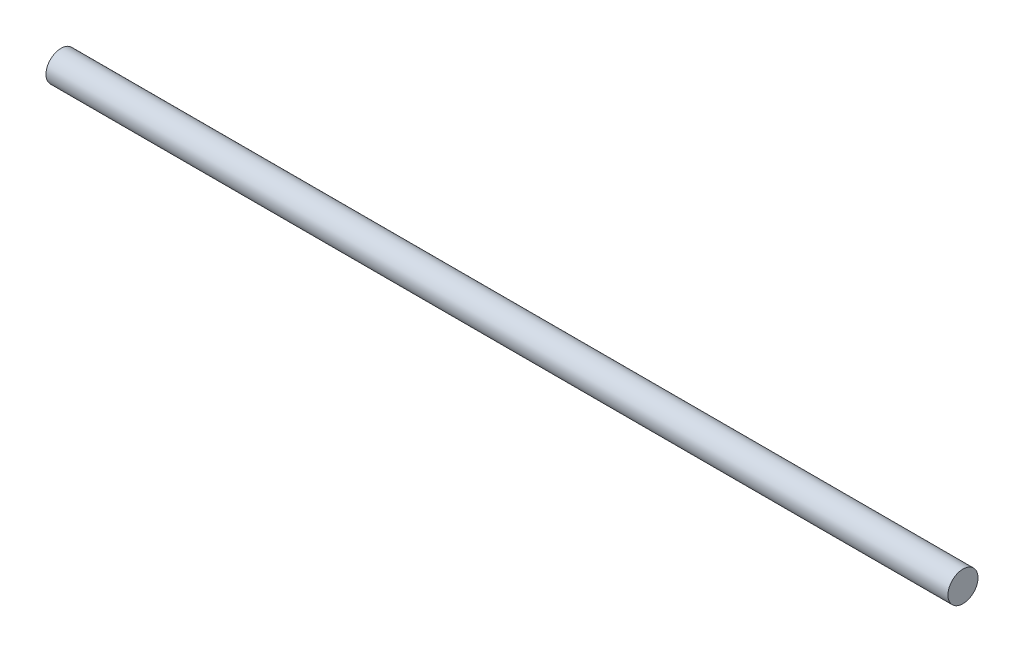
ISO-10303-21;
HEADER;
FILE_DESCRIPTION(('STEP AP214'),'2;1');
FILE_NAME('part.step','',(''),(''),'','','');
FILE_SCHEMA(('AUTOMOTIVE_DESIGN { 1 0 10303 214 1 1 1 1 }'));
ENDSEC;
DATA;
#1=APPLICATION_CONTEXT('core data for automotive mechanical design processes');
#2=APPLICATION_PROTOCOL_DEFINITION('international standard','automotive_design',2000,#1);
#3=PRODUCT_CONTEXT('',#1,'mechanical');
#4=PRODUCT('Part','Part','',(#3));
#5=PRODUCT_RELATED_PRODUCT_CATEGORY('part','',(#4));
#6=PRODUCT_DEFINITION_FORMATION('','',#4);
#7=PRODUCT_DEFINITION_CONTEXT('part definition',#1,'design');
#8=PRODUCT_DEFINITION('design','',#6,#7);
#9=PRODUCT_DEFINITION_SHAPE('','',#8);
#10=(LENGTH_UNIT() NAMED_UNIT(*) SI_UNIT(.MILLI.,.METRE.));
#11=(NAMED_UNIT(*) PLANE_ANGLE_UNIT() SI_UNIT($,.RADIAN.));
#12=(NAMED_UNIT(*) SI_UNIT($,.STERADIAN.) SOLID_ANGLE_UNIT());
#13=UNCERTAINTY_MEASURE_WITH_UNIT(LENGTH_MEASURE(1.E-05),#10,'distance_accuracy_value','');
#14=(GEOMETRIC_REPRESENTATION_CONTEXT(3) GLOBAL_UNCERTAINTY_ASSIGNED_CONTEXT((#13)) GLOBAL_UNIT_ASSIGNED_CONTEXT((#10,
#11,#12)) REPRESENTATION_CONTEXT('',''));
#15=CARTESIAN_POINT('',(0.,0.,0.));
#16=DIRECTION('',(0.,0.,1.));
#17=DIRECTION('',(1.,0.,0.));
#18=AXIS2_PLACEMENT_3D('',#15,#16,#17);
#19=CARTESIAN_POINT('',(120.,0.,0.));
#20=DIRECTION('',(-1.,0.,0.));
#21=DIRECTION('',(0.,0.,1.));
#22=AXIS2_PLACEMENT_3D('',#19,#20,#21);
#23=CYLINDRICAL_SURFACE('',#22,2.);
#24=CARTESIAN_POINT('',(120.,0.,0.));
#25=DIRECTION('',(1.,0.,0.));
#26=DIRECTION('',(0.,0.,-1.));
#27=AXIS2_PLACEMENT_3D('',#24,#25,#26);
#28=CIRCLE('',#27,2.);
#29=CARTESIAN_POINT('',(120.,0.,-2.));
#30=VERTEX_POINT('',#29);
#31=EDGE_CURVE('E10',#30,#30,#28,.T.);
#32=ORIENTED_EDGE('',*,*,#31,.F.);
#33=EDGE_LOOP('',(#32));
#34=FACE_BOUND('',#33,.T.);
#35=CARTESIAN_POINT('',(0.,0.,0.));
#36=DIRECTION('',(1.,0.,0.));
#37=DIRECTION('',(0.,0.,-1.));
#38=AXIS2_PLACEMENT_3D('',#35,#36,#37);
#39=CIRCLE('',#38,2.);
#40=CARTESIAN_POINT('',(0.,0.,-2.));
#41=VERTEX_POINT('',#40);
#42=EDGE_CURVE('E42',#41,#41,#39,.T.);
#43=ORIENTED_EDGE('',*,*,#42,.T.);
#44=EDGE_LOOP('',(#43));
#45=FACE_BOUND('',#44,.T.);
#46=ADVANCED_FACE('F39',(#34,#45),#23,.T.);
#47=CARTESIAN_POINT('',(120.,0.,0.));
#48=DIRECTION('',(1.,0.,0.));
#49=DIRECTION('',(0.,0.,-1.));
#50=AXIS2_PLACEMENT_3D('',#47,#48,#49);
#51=PLANE('',#50);
#52=ORIENTED_EDGE('',*,*,#31,.T.);
#53=EDGE_LOOP('',(#52));
#54=FACE_BOUND('',#53,.T.);
#55=ADVANCED_FACE('F54',(#54),#51,.T.);
#56=CARTESIAN_POINT('',(0.,0.,0.));
#57=DIRECTION('',(1.,0.,0.));
#58=DIRECTION('',(0.,0.,-1.));
#59=AXIS2_PLACEMENT_3D('',#56,#57,#58);
#60=PLANE('',#59);
#61=ORIENTED_EDGE('',*,*,#42,.F.);
#62=EDGE_LOOP('',(#61));
#63=FACE_BOUND('',#62,.T.);
#64=ADVANCED_FACE('F52',(#63),#60,.F.);
#65=CLOSED_SHELL('',(#46,#55,#64));
#66=MANIFOLD_SOLID_BREP('B2',#65);
#67=ADVANCED_BREP_SHAPE_REPRESENTATION('',(#18,#66),#14);
#68=SHAPE_DEFINITION_REPRESENTATION(#9,#67);
ENDSEC;
END-ISO-10303-21;
